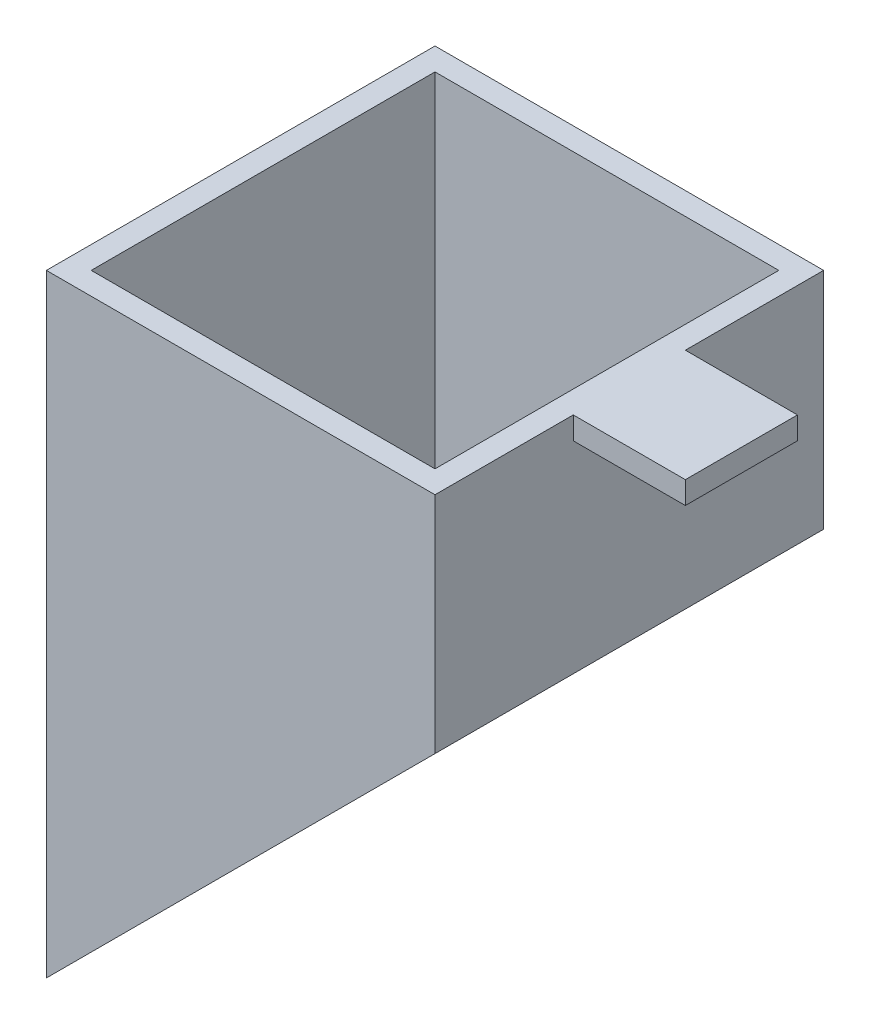
ISO-10303-21;
HEADER;
FILE_DESCRIPTION(('STEP AP214'),'2;1');
FILE_NAME('part.step','',(''),(''),'','','');
FILE_SCHEMA(('AUTOMOTIVE_DESIGN { 1 0 10303 214 1 1 1 1 }'));
ENDSEC;
DATA;
#1=APPLICATION_CONTEXT('core data for automotive mechanical design processes');
#2=APPLICATION_PROTOCOL_DEFINITION('international standard','automotive_design',2000,#1);
#3=PRODUCT_CONTEXT('',#1,'mechanical');
#4=PRODUCT('Part','Part','',(#3));
#5=PRODUCT_RELATED_PRODUCT_CATEGORY('part','',(#4));
#6=PRODUCT_DEFINITION_FORMATION('','',#4);
#7=PRODUCT_DEFINITION_CONTEXT('part definition',#1,'design');
#8=PRODUCT_DEFINITION('design','',#6,#7);
#9=PRODUCT_DEFINITION_SHAPE('','',#8);
#10=(LENGTH_UNIT() NAMED_UNIT(*) SI_UNIT(.MILLI.,.METRE.));
#11=(NAMED_UNIT(*) PLANE_ANGLE_UNIT() SI_UNIT($,.RADIAN.));
#12=(NAMED_UNIT(*) SI_UNIT($,.STERADIAN.) SOLID_ANGLE_UNIT());
#13=UNCERTAINTY_MEASURE_WITH_UNIT(LENGTH_MEASURE(1.E-05),#10,'distance_accuracy_value','');
#14=(GEOMETRIC_REPRESENTATION_CONTEXT(3) GLOBAL_UNCERTAINTY_ASSIGNED_CONTEXT((#13)) GLOBAL_UNIT_ASSIGNED_CONTEXT((#10,
#11,#12)) REPRESENTATION_CONTEXT('',''));
#15=CARTESIAN_POINT('',(0.,0.,0.));
#16=DIRECTION('',(0.,0.,1.));
#17=DIRECTION('',(1.,0.,0.));
#18=AXIS2_PLACEMENT_3D('',#15,#16,#17);
#19=CARTESIAN_POINT('',(52.,30.,0.));
#20=DIRECTION('',(-1.,0.,0.));
#21=DIRECTION('',(0.,0.,1.));
#22=AXIS2_PLACEMENT_3D('',#19,#20,#21);
#23=PLANE('',#22);
#24=DIRECTION('',(0.,1.,0.));
#25=VECTOR('',#24,1.);
#26=CARTESIAN_POINT('',(52.,27.,-33.5));
#27=LINE('',#26,#25);
#28=CARTESIAN_POINT('',(52.,27.,-33.5));
#29=VERTEX_POINT('',#28);
#30=CARTESIAN_POINT('',(52.,30.,-33.5));
#31=VERTEX_POINT('',#30);
#32=EDGE_CURVE('E143',#29,#31,#27,.T.);
#33=ORIENTED_EDGE('',*,*,#32,.F.);
#34=DIRECTION('',(0.,0.,1.));
#35=VECTOR('',#34,1.);
#36=CARTESIAN_POINT('',(52.,27.,-33.5));
#37=LINE('',#36,#35);
#38=CARTESIAN_POINT('',(52.,27.,-18.5));
#39=VERTEX_POINT('',#38);
#40=EDGE_CURVE('E137',#29,#39,#37,.T.);
#41=ORIENTED_EDGE('',*,*,#40,.T.);
#42=DIRECTION('',(0.,1.,0.));
#43=VECTOR('',#42,1.);
#44=CARTESIAN_POINT('',(52.,27.,-18.5));
#45=LINE('',#44,#43);
#46=CARTESIAN_POINT('',(52.,30.,-18.5));
#47=VERTEX_POINT('',#46);
#48=EDGE_CURVE('E122',#39,#47,#45,.T.);
#49=ORIENTED_EDGE('',*,*,#48,.T.);
#50=DIRECTION('',(0.,0.,-1.));
#51=VECTOR('',#50,1.);
#52=CARTESIAN_POINT('',(52.,30.,0.));
#53=LINE('',#52,#51);
#54=CARTESIAN_POINT('',(52.,30.,0.));
#55=VERTEX_POINT('',#54);
#56=EDGE_CURVE('E203',#55,#47,#53,.T.);
#57=ORIENTED_EDGE('',*,*,#56,.F.);
#58=DIRECTION('',(0.,-1.,0.));
#59=VECTOR('',#58,1.);
#60=CARTESIAN_POINT('',(52.,30.,0.));
#61=LINE('',#60,#59);
#62=CARTESIAN_POINT('',(52.,0.,0.));
#63=VERTEX_POINT('',#62);
#64=EDGE_CURVE('E43',#55,#63,#61,.T.);
#65=ORIENTED_EDGE('',*,*,#64,.T.);
#66=DIRECTION('',(0.,0.,-1.));
#67=VECTOR('',#66,1.);
#68=CARTESIAN_POINT('',(52.,0.,0.));
#69=LINE('',#68,#67);
#70=CARTESIAN_POINT('',(52.,0.,-52.));
#71=VERTEX_POINT('',#70);
#72=EDGE_CURVE('E192',#63,#71,#69,.T.);
#73=ORIENTED_EDGE('',*,*,#72,.T.);
#74=DIRECTION('',(0.,-1.,0.));
#75=VECTOR('',#74,1.);
#76=CARTESIAN_POINT('',(52.,30.,-52.));
#77=LINE('',#76,#75);
#78=CARTESIAN_POINT('',(52.,30.,-52.));
#79=VERTEX_POINT('',#78);
#80=EDGE_CURVE('E211',#79,#71,#77,.T.);
#81=ORIENTED_EDGE('',*,*,#80,.F.);
#82=EDGE_CURVE('E202',#31,#79,#53,.T.);
#83=ORIENTED_EDGE('',*,*,#82,.F.);
#84=EDGE_LOOP('',(#33,#41,#49,#57,#65,#73,#81,#83));
#85=FACE_BOUND('',#84,.T.);
#86=ADVANCED_FACE('F35',(#85),#23,.F.);
#87=CARTESIAN_POINT('',(0.,30.,0.));
#88=DIRECTION('',(0.,-1.,0.));
#89=DIRECTION('',(0.,0.,-1.));
#90=AXIS2_PLACEMENT_3D('',#87,#88,#89);
#91=PLANE('',#90);
#92=DIRECTION('',(0.,0.,1.));
#93=VECTOR('',#92,1.);
#94=CARTESIAN_POINT('',(0.,30.,0.));
#95=LINE('',#94,#93);
#96=CARTESIAN_POINT('',(0.,30.,-52.));
#97=VERTEX_POINT('',#96);
#98=CARTESIAN_POINT('',(0.,30.,0.));
#99=VERTEX_POINT('',#98);
#100=EDGE_CURVE('E197',#97,#99,#95,.T.);
#101=ORIENTED_EDGE('',*,*,#100,.T.);
#102=DIRECTION('',(1.,0.,0.));
#103=VECTOR('',#102,1.);
#104=CARTESIAN_POINT('',(0.,30.,0.));
#105=LINE('',#104,#103);
#106=EDGE_CURVE('E200',#99,#55,#105,.T.);
#107=ORIENTED_EDGE('',*,*,#106,.T.);
#108=ORIENTED_EDGE('',*,*,#56,.T.);
#109=DIRECTION('',(1.,0.,0.));
#110=VECTOR('',#109,1.);
#111=CARTESIAN_POINT('',(52.,30.,-18.5));
#112=LINE('',#111,#110);
#113=CARTESIAN_POINT('',(67.,30.,-18.5));
#114=VERTEX_POINT('',#113);
#115=EDGE_CURVE('E50',#47,#114,#112,.T.);
#116=ORIENTED_EDGE('',*,*,#115,.T.);
#117=DIRECTION('',(0.,0.,-1.));
#118=VECTOR('',#117,1.);
#119=CARTESIAN_POINT('',(67.,30.,-26.));
#120=LINE('',#119,#118);
#121=CARTESIAN_POINT('',(67.,30.,-33.5));
#122=VERTEX_POINT('',#121);
#123=EDGE_CURVE('E147',#114,#122,#120,.T.);
#124=ORIENTED_EDGE('',*,*,#123,.T.);
#125=DIRECTION('',(-1.,0.,0.));
#126=VECTOR('',#125,1.);
#127=CARTESIAN_POINT('',(67.,30.,-33.5));
#128=LINE('',#127,#126);
#129=EDGE_CURVE('E144',#122,#31,#128,.T.);
#130=ORIENTED_EDGE('',*,*,#129,.T.);
#131=ORIENTED_EDGE('',*,*,#82,.T.);
#132=DIRECTION('',(-1.,0.,0.));
#133=VECTOR('',#132,1.);
#134=CARTESIAN_POINT('',(0.,30.,-52.));
#135=LINE('',#134,#133);
#136=EDGE_CURVE('E205',#79,#97,#135,.T.);
#137=ORIENTED_EDGE('',*,*,#136,.T.);
#138=EDGE_LOOP('',(#101,#107,#108,#116,#124,#130,#131,#137));
#139=FACE_BOUND('',#138,.T.);
#140=DIRECTION('',(0.,0.,1.));
#141=VECTOR('',#140,1.);
#142=CARTESIAN_POINT('',(3.,30.,0.));
#143=LINE('',#142,#141);
#144=CARTESIAN_POINT('',(3.00000000000001,30.,-49.));
#145=VERTEX_POINT('',#144);
#146=CARTESIAN_POINT('',(3.,30.,-3.));
#147=VERTEX_POINT('',#146);
#148=EDGE_CURVE('E180',#145,#147,#143,.T.);
#149=ORIENTED_EDGE('',*,*,#148,.F.);
#150=DIRECTION('',(-1.,0.,0.));
#151=VECTOR('',#150,1.);
#152=CARTESIAN_POINT('',(0.,30.,-49.));
#153=LINE('',#152,#151);
#154=CARTESIAN_POINT('',(49.,30.,-49.));
#155=VERTEX_POINT('',#154);
#156=EDGE_CURVE('E162',#155,#145,#153,.T.);
#157=ORIENTED_EDGE('',*,*,#156,.F.);
#158=DIRECTION('',(0.,0.,-1.));
#159=VECTOR('',#158,1.);
#160=CARTESIAN_POINT('',(49.,30.,0.));
#161=LINE('',#160,#159);
#162=CARTESIAN_POINT('',(49.,30.,-3.));
#163=VERTEX_POINT('',#162);
#164=EDGE_CURVE('E186',#163,#155,#161,.T.);
#165=ORIENTED_EDGE('',*,*,#164,.F.);
#166=DIRECTION('',(1.,0.,0.));
#167=VECTOR('',#166,1.);
#168=CARTESIAN_POINT('',(0.,30.,-3.));
#169=LINE('',#168,#167);
#170=EDGE_CURVE('E184',#147,#163,#169,.T.);
#171=ORIENTED_EDGE('',*,*,#170,.F.);
#172=EDGE_LOOP('',(#149,#157,#165,#171));
#173=FACE_BOUND('',#172,.T.);
#174=ADVANCED_FACE('F231',(#139,#173),#91,.F.);
#175=CARTESIAN_POINT('',(0.,-51.9999999999995,-125.539105243401));
#176=DIRECTION('',(0.707106781186544,-0.707106781186551,0.));
#177=DIRECTION('',(0.707106781186551,0.707106781186544,0.));
#178=AXIS2_PLACEMENT_3D('',#175,#176,#177);
#179=PLANE('',#178);
#180=DIRECTION('',(-0.707106781186551,-0.707106781186544,0.));
#181=VECTOR('',#180,1.);
#182=CARTESIAN_POINT('',(0.,-51.9999999999995,-52.));
#183=LINE('',#182,#181);
#184=CARTESIAN_POINT('',(0.,-51.9999999999995,-52.));
#185=VERTEX_POINT('',#184);
#186=EDGE_CURVE('E189',#71,#185,#183,.T.);
#187=ORIENTED_EDGE('',*,*,#186,.F.);
#188=ORIENTED_EDGE('',*,*,#72,.F.);
#189=DIRECTION('',(0.707106781186551,0.707106781186544,0.));
#190=VECTOR('',#189,1.);
#191=CARTESIAN_POINT('',(0.,-51.9999999999995,0.));
#192=LINE('',#191,#190);
#193=CARTESIAN_POINT('',(0.,-51.9999999999995,0.));
#194=VERTEX_POINT('',#193);
#195=EDGE_CURVE('E166',#194,#63,#192,.T.);
#196=ORIENTED_EDGE('',*,*,#195,.F.);
#197=DIRECTION('',(0.,0.,1.));
#198=VECTOR('',#197,1.);
#199=CARTESIAN_POINT('',(0.,-51.9999999999995,-125.539105243401));
#200=LINE('',#199,#198);
#201=EDGE_CURVE('E193',#185,#194,#200,.T.);
#202=ORIENTED_EDGE('',*,*,#201,.F.);
#203=EDGE_LOOP('',(#187,#188,#196,#202));
#204=FACE_BOUND('',#203,.T.);
#205=DIRECTION('',(0.,0.,-1.));
#206=VECTOR('',#205,1.);
#207=CARTESIAN_POINT('',(49.,-2.99999999999998,-125.539105243401));
#208=LINE('',#207,#206);
#209=CARTESIAN_POINT('',(49.,-2.99999999999998,-3.));
#210=VERTEX_POINT('',#209);
#211=CARTESIAN_POINT('',(49.,-2.99999999999998,-49.));
#212=VERTEX_POINT('',#211);
#213=EDGE_CURVE('E177',#210,#212,#208,.T.);
#214=ORIENTED_EDGE('',*,*,#213,.T.);
#215=DIRECTION('',(-0.707106781186551,-0.707106781186544,0.));
#216=VECTOR('',#215,1.);
#217=CARTESIAN_POINT('',(0.,-51.9999999999995,-49.));
#218=LINE('',#217,#216);
#219=CARTESIAN_POINT('',(3.00000000000001,-48.9999999999995,-49.));
#220=VERTEX_POINT('',#219);
#221=EDGE_CURVE('E174',#212,#220,#218,.T.);
#222=ORIENTED_EDGE('',*,*,#221,.T.);
#223=DIRECTION('',(0.,0.,1.));
#224=VECTOR('',#223,1.);
#225=CARTESIAN_POINT('',(3.00000000000002,-48.9999999999995,-125.539105243401));
#226=LINE('',#225,#224);
#227=CARTESIAN_POINT('',(3.,-48.9999999999995,-3.));
#228=VERTEX_POINT('',#227);
#229=EDGE_CURVE('E171',#220,#228,#226,.T.);
#230=ORIENTED_EDGE('',*,*,#229,.T.);
#231=DIRECTION('',(0.707106781186551,0.707106781186544,0.));
#232=VECTOR('',#231,1.);
#233=CARTESIAN_POINT('',(0.,-51.9999999999995,-3.));
#234=LINE('',#233,#232);
#235=EDGE_CURVE('E156',#228,#210,#234,.T.);
#236=ORIENTED_EDGE('',*,*,#235,.T.);
#237=EDGE_LOOP('',(#214,#222,#230,#236));
#238=FACE_BOUND('',#237,.T.);
#239=ADVANCED_FACE('F223',(#204,#238),#179,.T.);
#240=CARTESIAN_POINT('',(0.,30.,0.));
#241=DIRECTION('',(1.,0.,0.));
#242=DIRECTION('',(0.,0.,-1.));
#243=AXIS2_PLACEMENT_3D('',#240,#241,#242);
#244=PLANE('',#243);
#245=DIRECTION('',(0.,-1.,0.));
#246=VECTOR('',#245,1.);
#247=CARTESIAN_POINT('',(0.,30.,-52.));
#248=LINE('',#247,#246);
#249=EDGE_CURVE('E207',#97,#185,#248,.T.);
#250=ORIENTED_EDGE('',*,*,#249,.T.);
#251=ORIENTED_EDGE('',*,*,#201,.T.);
#252=DIRECTION('',(0.,-1.,0.));
#253=VECTOR('',#252,1.);
#254=CARTESIAN_POINT('',(0.,30.,0.));
#255=LINE('',#254,#253);
#256=EDGE_CURVE('E11',#99,#194,#255,.T.);
#257=ORIENTED_EDGE('',*,*,#256,.F.);
#258=ORIENTED_EDGE('',*,*,#100,.F.);
#259=EDGE_LOOP('',(#250,#251,#257,#258));
#260=FACE_BOUND('',#259,.T.);
#261=ADVANCED_FACE('F37',(#260),#244,.F.);
#262=CARTESIAN_POINT('',(0.,30.,0.));
#263=DIRECTION('',(0.,0.,-1.));
#264=DIRECTION('',(-1.,0.,0.));
#265=AXIS2_PLACEMENT_3D('',#262,#263,#264);
#266=PLANE('',#265);
#267=ORIENTED_EDGE('',*,*,#256,.T.);
#268=ORIENTED_EDGE('',*,*,#195,.T.);
#269=ORIENTED_EDGE('',*,*,#64,.F.);
#270=ORIENTED_EDGE('',*,*,#106,.F.);
#271=EDGE_LOOP('',(#267,#268,#269,#270));
#272=FACE_BOUND('',#271,.T.);
#273=ADVANCED_FACE('F218',(#272),#266,.F.);
#274=CARTESIAN_POINT('',(0.,30.,-52.));
#275=DIRECTION('',(0.,0.,1.));
#276=DIRECTION('',(1.,0.,0.));
#277=AXIS2_PLACEMENT_3D('',#274,#275,#276);
#278=PLANE('',#277);
#279=ORIENTED_EDGE('',*,*,#80,.T.);
#280=ORIENTED_EDGE('',*,*,#186,.T.);
#281=ORIENTED_EDGE('',*,*,#249,.F.);
#282=ORIENTED_EDGE('',*,*,#136,.F.);
#283=EDGE_LOOP('',(#279,#280,#281,#282));
#284=FACE_BOUND('',#283,.T.);
#285=ADVANCED_FACE('F227',(#284),#278,.F.);
#286=CARTESIAN_POINT('',(3.,30.,0.));
#287=DIRECTION('',(1.,0.,0.));
#288=DIRECTION('',(0.,0.,-1.));
#289=AXIS2_PLACEMENT_3D('',#286,#287,#288);
#290=PLANE('',#289);
#291=DIRECTION('',(0.,-1.,0.));
#292=VECTOR('',#291,1.);
#293=CARTESIAN_POINT('',(3.00000000000001,30.,-49.));
#294=LINE('',#293,#292);
#295=EDGE_CURVE('E160',#145,#220,#294,.T.);
#296=ORIENTED_EDGE('',*,*,#295,.F.);
#297=ORIENTED_EDGE('',*,*,#148,.T.);
#298=DIRECTION('',(0.,-1.,0.));
#299=VECTOR('',#298,1.);
#300=CARTESIAN_POINT('',(3.,30.,-3.));
#301=LINE('',#300,#299);
#302=EDGE_CURVE('E163',#147,#228,#301,.T.);
#303=ORIENTED_EDGE('',*,*,#302,.T.);
#304=ORIENTED_EDGE('',*,*,#229,.F.);
#305=EDGE_LOOP('',(#296,#297,#303,#304));
#306=FACE_BOUND('',#305,.T.);
#307=ADVANCED_FACE('F254',(#306),#290,.T.);
#308=CARTESIAN_POINT('',(0.,30.,-3.));
#309=DIRECTION('',(0.,0.,-1.));
#310=DIRECTION('',(-1.,0.,0.));
#311=AXIS2_PLACEMENT_3D('',#308,#309,#310);
#312=PLANE('',#311);
#313=ORIENTED_EDGE('',*,*,#302,.F.);
#314=ORIENTED_EDGE('',*,*,#170,.T.);
#315=DIRECTION('',(0.,-1.,0.));
#316=VECTOR('',#315,1.);
#317=CARTESIAN_POINT('',(49.,30.,-3.));
#318=LINE('',#317,#316);
#319=EDGE_CURVE('E167',#163,#210,#318,.T.);
#320=ORIENTED_EDGE('',*,*,#319,.T.);
#321=ORIENTED_EDGE('',*,*,#235,.F.);
#322=EDGE_LOOP('',(#313,#314,#320,#321));
#323=FACE_BOUND('',#322,.T.);
#324=ADVANCED_FACE('F262',(#323),#312,.T.);
#325=CARTESIAN_POINT('',(49.,30.,0.));
#326=DIRECTION('',(-1.,0.,0.));
#327=DIRECTION('',(0.,0.,1.));
#328=AXIS2_PLACEMENT_3D('',#325,#326,#327);
#329=PLANE('',#328);
#330=ORIENTED_EDGE('',*,*,#213,.F.);
#331=ORIENTED_EDGE('',*,*,#319,.F.);
#332=ORIENTED_EDGE('',*,*,#164,.T.);
#333=DIRECTION('',(0.,-1.,0.));
#334=VECTOR('',#333,1.);
#335=CARTESIAN_POINT('',(49.,30.,-49.));
#336=LINE('',#335,#334);
#337=EDGE_CURVE('E58',#155,#212,#336,.T.);
#338=ORIENTED_EDGE('',*,*,#337,.T.);
#339=EDGE_LOOP('',(#330,#331,#332,#338));
#340=FACE_BOUND('',#339,.T.);
#341=ADVANCED_FACE('F259',(#340),#329,.T.);
#342=CARTESIAN_POINT('',(0.,30.,-49.));
#343=DIRECTION('',(0.,0.,1.));
#344=DIRECTION('',(1.,0.,0.));
#345=AXIS2_PLACEMENT_3D('',#342,#343,#344);
#346=PLANE('',#345);
#347=ORIENTED_EDGE('',*,*,#337,.F.);
#348=ORIENTED_EDGE('',*,*,#156,.T.);
#349=ORIENTED_EDGE('',*,*,#295,.T.);
#350=ORIENTED_EDGE('',*,*,#221,.F.);
#351=EDGE_LOOP('',(#347,#348,#349,#350));
#352=FACE_BOUND('',#351,.T.);
#353=ADVANCED_FACE('F256',(#352),#346,.T.);
#354=CARTESIAN_POINT('',(67.,27.,-33.5));
#355=DIRECTION('',(0.,0.,-1.));
#356=DIRECTION('',(-1.,0.,0.));
#357=AXIS2_PLACEMENT_3D('',#354,#355,#356);
#358=PLANE('',#357);
#359=ORIENTED_EDGE('',*,*,#129,.F.);
#360=DIRECTION('',(0.,1.,0.));
#361=VECTOR('',#360,1.);
#362=CARTESIAN_POINT('',(67.,27.,-33.5));
#363=LINE('',#362,#361);
#364=CARTESIAN_POINT('',(67.,27.,-33.5));
#365=VERTEX_POINT('',#364);
#366=EDGE_CURVE('E157',#365,#122,#363,.T.);
#367=ORIENTED_EDGE('',*,*,#366,.F.);
#368=DIRECTION('',(-1.,0.,0.));
#369=VECTOR('',#368,1.);
#370=CARTESIAN_POINT('',(67.,27.,-33.5));
#371=LINE('',#370,#369);
#372=EDGE_CURVE('E131',#365,#29,#371,.T.);
#373=ORIENTED_EDGE('',*,*,#372,.T.);
#374=ORIENTED_EDGE('',*,*,#32,.T.);
#375=EDGE_LOOP('',(#359,#367,#373,#374));
#376=FACE_BOUND('',#375,.T.);
#377=ADVANCED_FACE('F236',(#376),#358,.T.);
#378=CARTESIAN_POINT('',(67.,27.,-26.));
#379=DIRECTION('',(1.,0.,0.));
#380=DIRECTION('',(0.,0.,-1.));
#381=AXIS2_PLACEMENT_3D('',#378,#379,#380);
#382=PLANE('',#381);
#383=ORIENTED_EDGE('',*,*,#123,.F.);
#384=DIRECTION('',(0.,1.,0.));
#385=VECTOR('',#384,1.);
#386=CARTESIAN_POINT('',(67.,27.,-18.5));
#387=LINE('',#386,#385);
#388=CARTESIAN_POINT('',(67.,27.,-18.5));
#389=VERTEX_POINT('',#388);
#390=EDGE_CURVE('E130',#389,#114,#387,.T.);
#391=ORIENTED_EDGE('',*,*,#390,.F.);
#392=DIRECTION('',(0.,0.,-1.));
#393=VECTOR('',#392,1.);
#394=CARTESIAN_POINT('',(67.,27.,-18.5));
#395=LINE('',#394,#393);
#396=EDGE_CURVE('E139',#389,#365,#395,.T.);
#397=ORIENTED_EDGE('',*,*,#396,.T.);
#398=ORIENTED_EDGE('',*,*,#366,.T.);
#399=EDGE_LOOP('',(#383,#391,#397,#398));
#400=FACE_BOUND('',#399,.T.);
#401=ADVANCED_FACE('F238',(#400),#382,.T.);
#402=CARTESIAN_POINT('',(52.,27.,-18.5));
#403=DIRECTION('',(0.,0.,1.));
#404=DIRECTION('',(1.,0.,0.));
#405=AXIS2_PLACEMENT_3D('',#402,#403,#404);
#406=PLANE('',#405);
#407=ORIENTED_EDGE('',*,*,#115,.F.);
#408=ORIENTED_EDGE('',*,*,#48,.F.);
#409=DIRECTION('',(1.,0.,0.));
#410=VECTOR('',#409,1.);
#411=CARTESIAN_POINT('',(52.,27.,-18.5));
#412=LINE('',#411,#410);
#413=EDGE_CURVE('E125',#39,#389,#412,.T.);
#414=ORIENTED_EDGE('',*,*,#413,.T.);
#415=ORIENTED_EDGE('',*,*,#390,.T.);
#416=EDGE_LOOP('',(#407,#408,#414,#415));
#417=FACE_BOUND('',#416,.T.);
#418=ADVANCED_FACE('F124',(#417),#406,.T.);
#419=CARTESIAN_POINT('',(0.,27.,0.));
#420=DIRECTION('',(0.,1.,0.));
#421=DIRECTION('',(0.,0.,1.));
#422=AXIS2_PLACEMENT_3D('',#419,#420,#421);
#423=PLANE('',#422);
#424=ORIENTED_EDGE('',*,*,#40,.F.);
#425=ORIENTED_EDGE('',*,*,#372,.F.);
#426=ORIENTED_EDGE('',*,*,#396,.F.);
#427=ORIENTED_EDGE('',*,*,#413,.F.);
#428=EDGE_LOOP('',(#424,#425,#426,#427));
#429=FACE_BOUND('',#428,.T.);
#430=ADVANCED_FACE('F135',(#429),#423,.F.);
#431=CLOSED_SHELL('',(#86,#174,#239,#261,#273,#285,#307,#324,#341,#353,#377,#401,#418,#430));
#432=MANIFOLD_SOLID_BREP('B2',#431);
#433=ADVANCED_BREP_SHAPE_REPRESENTATION('',(#18,#432),#14);
#434=SHAPE_DEFINITION_REPRESENTATION(#9,#433);
ENDSEC;
END-ISO-10303-21;
